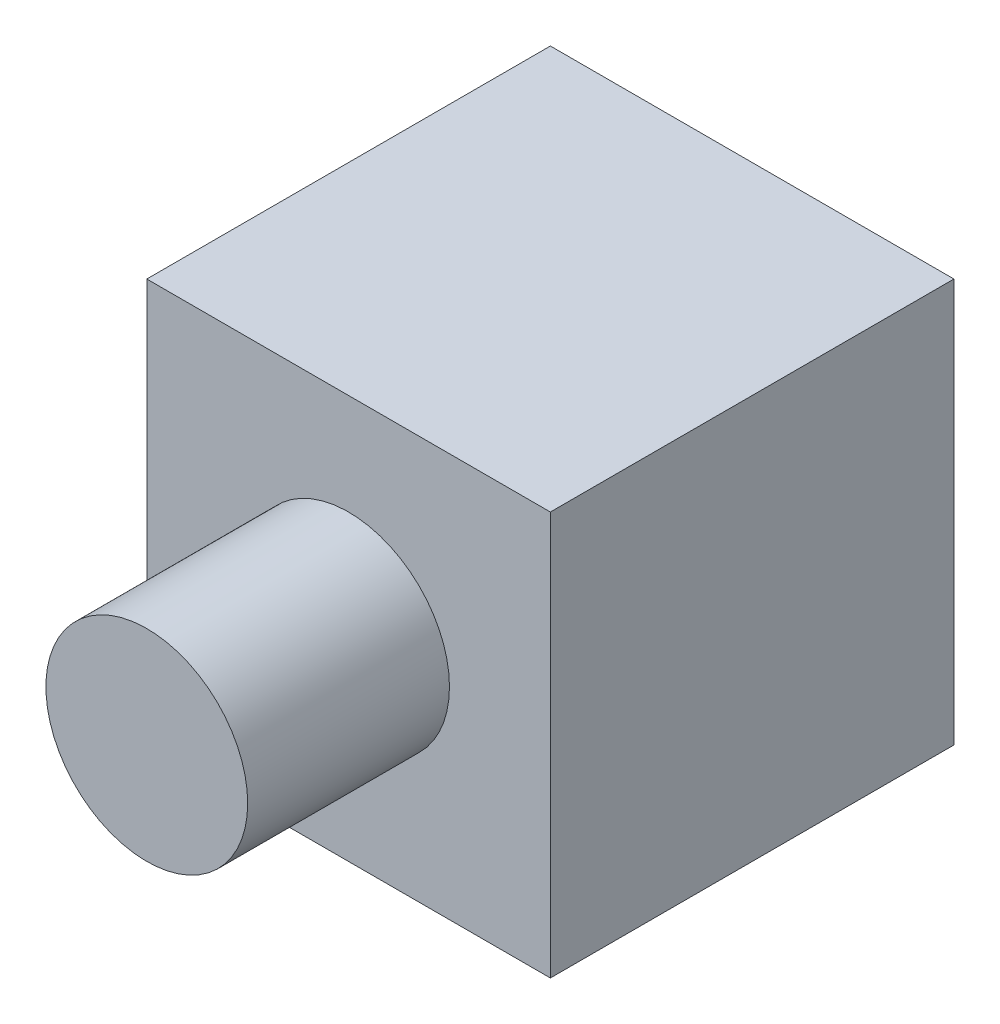
ISO-10303-21;
HEADER;
FILE_DESCRIPTION(('STEP AP214'),'2;1');
FILE_NAME('part.step','',(''),(''),'','','');
FILE_SCHEMA(('AUTOMOTIVE_DESIGN { 1 0 10303 214 1 1 1 1 }'));
ENDSEC;
DATA;
#1=APPLICATION_CONTEXT('core data for automotive mechanical design processes');
#2=APPLICATION_PROTOCOL_DEFINITION('international standard','automotive_design',2000,#1);
#3=PRODUCT_CONTEXT('',#1,'mechanical');
#4=PRODUCT('Part','Part','',(#3));
#5=PRODUCT_RELATED_PRODUCT_CATEGORY('part','',(#4));
#6=PRODUCT_DEFINITION_FORMATION('','',#4);
#7=PRODUCT_DEFINITION_CONTEXT('part definition',#1,'design');
#8=PRODUCT_DEFINITION('design','',#6,#7);
#9=PRODUCT_DEFINITION_SHAPE('','',#8);
#10=(LENGTH_UNIT() NAMED_UNIT(*) SI_UNIT(.MILLI.,.METRE.));
#11=(NAMED_UNIT(*) PLANE_ANGLE_UNIT() SI_UNIT($,.RADIAN.));
#12=(NAMED_UNIT(*) SI_UNIT($,.STERADIAN.) SOLID_ANGLE_UNIT());
#13=UNCERTAINTY_MEASURE_WITH_UNIT(LENGTH_MEASURE(1.E-05),#10,'distance_accuracy_value','');
#14=(GEOMETRIC_REPRESENTATION_CONTEXT(3) GLOBAL_UNCERTAINTY_ASSIGNED_CONTEXT((#13)) GLOBAL_UNIT_ASSIGNED_CONTEXT((#10,
#11,#12)) REPRESENTATION_CONTEXT('',''));
#15=CARTESIAN_POINT('',(0.,0.,0.));
#16=DIRECTION('',(0.,0.,1.));
#17=DIRECTION('',(1.,0.,0.));
#18=AXIS2_PLACEMENT_3D('',#15,#16,#17);
#19=CARTESIAN_POINT('',(25.4,25.4,-50.8));
#20=DIRECTION('',(1.,0.,0.));
#21=DIRECTION('',(0.,1.,0.));
#22=AXIS2_PLACEMENT_3D('',#19,#20,#21);
#23=PLANE('',#22);
#24=DIRECTION('',(0.,1.,0.));
#25=VECTOR('',#24,1.);
#26=CARTESIAN_POINT('',(25.4,25.4,0.));
#27=LINE('',#26,#25);
#28=CARTESIAN_POINT('',(25.4,-25.4,0.));
#29=VERTEX_POINT('',#28);
#30=CARTESIAN_POINT('',(25.4,25.4,0.));
#31=VERTEX_POINT('',#30);
#32=EDGE_CURVE('E110',#29,#31,#27,.T.);
#33=ORIENTED_EDGE('',*,*,#32,.F.);
#34=DIRECTION('',(0.,0.,1.));
#35=VECTOR('',#34,1.);
#36=CARTESIAN_POINT('',(25.4,-25.4,-50.8));
#37=LINE('',#36,#35);
#38=CARTESIAN_POINT('',(25.4,-25.4,-50.8));
#39=VERTEX_POINT('',#38);
#40=EDGE_CURVE('E48',#39,#29,#37,.T.);
#41=ORIENTED_EDGE('',*,*,#40,.F.);
#42=DIRECTION('',(0.,1.,0.));
#43=VECTOR('',#42,1.);
#44=CARTESIAN_POINT('',(25.4,25.4,-50.8));
#45=LINE('',#44,#43);
#46=CARTESIAN_POINT('',(25.4,25.4,-50.8));
#47=VERTEX_POINT('',#46);
#48=EDGE_CURVE('E102',#39,#47,#45,.T.);
#49=ORIENTED_EDGE('',*,*,#48,.T.);
#50=DIRECTION('',(0.,0.,1.));
#51=VECTOR('',#50,1.);
#52=CARTESIAN_POINT('',(25.4,25.4,-50.8));
#53=LINE('',#52,#51);
#54=EDGE_CURVE('E41',#47,#31,#53,.T.);
#55=ORIENTED_EDGE('',*,*,#54,.T.);
#56=EDGE_LOOP('',(#33,#41,#49,#55));
#57=FACE_BOUND('',#56,.T.);
#58=ADVANCED_FACE('F38',(#57),#23,.T.);
#59=CARTESIAN_POINT('',(-25.4,-25.4,-50.8));
#60=DIRECTION('',(0.,-1.,0.));
#61=DIRECTION('',(0.,0.,-1.));
#62=AXIS2_PLACEMENT_3D('',#59,#60,#61);
#63=PLANE('',#62);
#64=DIRECTION('',(1.,0.,0.));
#65=VECTOR('',#64,1.);
#66=CARTESIAN_POINT('',(-25.4,-25.4,0.));
#67=LINE('',#66,#65);
#68=CARTESIAN_POINT('',(-25.4,-25.4,0.));
#69=VERTEX_POINT('',#68);
#70=EDGE_CURVE('E105',#69,#29,#67,.T.);
#71=ORIENTED_EDGE('',*,*,#70,.F.);
#72=DIRECTION('',(0.,0.,1.));
#73=VECTOR('',#72,1.);
#74=CARTESIAN_POINT('',(-25.4,-25.4,-50.8));
#75=LINE('',#74,#73);
#76=CARTESIAN_POINT('',(-25.4,-25.4,-50.8));
#77=VERTEX_POINT('',#76);
#78=EDGE_CURVE('E73',#77,#69,#75,.T.);
#79=ORIENTED_EDGE('',*,*,#78,.F.);
#80=DIRECTION('',(1.,0.,0.));
#81=VECTOR('',#80,1.);
#82=CARTESIAN_POINT('',(-25.4,-25.4,-50.8));
#83=LINE('',#82,#81);
#84=EDGE_CURVE('E97',#77,#39,#83,.T.);
#85=ORIENTED_EDGE('',*,*,#84,.T.);
#86=ORIENTED_EDGE('',*,*,#40,.T.);
#87=EDGE_LOOP('',(#71,#79,#85,#86));
#88=FACE_BOUND('',#87,.T.);
#89=ADVANCED_FACE('F129',(#88),#63,.T.);
#90=CARTESIAN_POINT('',(-25.4,25.4,-50.8));
#91=DIRECTION('',(-1.,0.,0.));
#92=DIRECTION('',(0.,-1.,0.));
#93=AXIS2_PLACEMENT_3D('',#90,#91,#92);
#94=PLANE('',#93);
#95=DIRECTION('',(0.,-1.,0.));
#96=VECTOR('',#95,1.);
#97=CARTESIAN_POINT('',(-25.4,25.4,0.));
#98=LINE('',#97,#96);
#99=CARTESIAN_POINT('',(-25.4,25.4,0.));
#100=VERTEX_POINT('',#99);
#101=EDGE_CURVE('E91',#100,#69,#98,.T.);
#102=ORIENTED_EDGE('',*,*,#101,.F.);
#103=DIRECTION('',(0.,0.,1.));
#104=VECTOR('',#103,1.);
#105=CARTESIAN_POINT('',(-25.4,25.4,-50.8));
#106=LINE('',#105,#104);
#107=CARTESIAN_POINT('',(-25.4,25.4,-50.8));
#108=VERTEX_POINT('',#107);
#109=EDGE_CURVE('E86',#108,#100,#106,.T.);
#110=ORIENTED_EDGE('',*,*,#109,.F.);
#111=DIRECTION('',(0.,-1.,0.));
#112=VECTOR('',#111,1.);
#113=CARTESIAN_POINT('',(-25.4,25.4,-50.8));
#114=LINE('',#113,#112);
#115=EDGE_CURVE('E89',#108,#77,#114,.T.);
#116=ORIENTED_EDGE('',*,*,#115,.T.);
#117=ORIENTED_EDGE('',*,*,#78,.T.);
#118=EDGE_LOOP('',(#102,#110,#116,#117));
#119=FACE_BOUND('',#118,.T.);
#120=ADVANCED_FACE('F88',(#119),#94,.T.);
#121=CARTESIAN_POINT('',(-25.4,25.4,-50.8));
#122=DIRECTION('',(0.,1.,0.));
#123=DIRECTION('',(0.,0.,1.));
#124=AXIS2_PLACEMENT_3D('',#121,#122,#123);
#125=PLANE('',#124);
#126=DIRECTION('',(-1.,0.,0.));
#127=VECTOR('',#126,1.);
#128=CARTESIAN_POINT('',(-25.4,25.4,0.));
#129=LINE('',#128,#127);
#130=EDGE_CURVE('E114',#31,#100,#129,.T.);
#131=ORIENTED_EDGE('',*,*,#130,.F.);
#132=ORIENTED_EDGE('',*,*,#54,.F.);
#133=DIRECTION('',(-1.,0.,0.));
#134=VECTOR('',#133,1.);
#135=CARTESIAN_POINT('',(-25.4,25.4,-50.8));
#136=LINE('',#135,#134);
#137=EDGE_CURVE('E96',#47,#108,#136,.T.);
#138=ORIENTED_EDGE('',*,*,#137,.T.);
#139=ORIENTED_EDGE('',*,*,#109,.T.);
#140=EDGE_LOOP('',(#131,#132,#138,#139));
#141=FACE_BOUND('',#140,.T.);
#142=ADVANCED_FACE('F100',(#141),#125,.T.);
#143=CARTESIAN_POINT('',(0.,0.,-50.8));
#144=DIRECTION('',(0.,0.,1.));
#145=DIRECTION('',(1.,0.,0.));
#146=AXIS2_PLACEMENT_3D('',#143,#144,#145);
#147=PLANE('',#146);
#148=CARTESIAN_POINT('',(0.,0.,-50.8));
#149=DIRECTION('',(0.,0.,-1.));
#150=DIRECTION('',(-1.,0.,0.));
#151=AXIS2_PLACEMENT_3D('',#148,#149,#150);
#152=CIRCLE('',#151,12.7);
#153=CARTESIAN_POINT('',(-12.7,0.,-50.8));
#154=VERTEX_POINT('',#153);
#155=EDGE_CURVE('E171',#154,#154,#152,.T.);
#156=ORIENTED_EDGE('',*,*,#155,.F.);
#157=EDGE_LOOP('',(#156));
#158=FACE_BOUND('',#157,.T.);
#159=ORIENTED_EDGE('',*,*,#48,.F.);
#160=ORIENTED_EDGE('',*,*,#84,.F.);
#161=ORIENTED_EDGE('',*,*,#115,.F.);
#162=ORIENTED_EDGE('',*,*,#137,.F.);
#163=EDGE_LOOP('',(#159,#160,#161,#162));
#164=FACE_BOUND('',#163,.T.);
#165=ADVANCED_FACE('F95',(#158,#164),#147,.F.);
#166=CARTESIAN_POINT('',(0.,0.,0.));
#167=DIRECTION('',(0.,0.,1.));
#168=DIRECTION('',(1.,0.,0.));
#169=AXIS2_PLACEMENT_3D('',#166,#167,#168);
#170=PLANE('',#169);
#171=CARTESIAN_POINT('',(0.,0.,0.));
#172=DIRECTION('',(0.,0.,1.));
#173=DIRECTION('',(1.,0.,0.));
#174=AXIS2_PLACEMENT_3D('',#171,#172,#173);
#175=CIRCLE('',#174,12.7);
#176=CARTESIAN_POINT('',(12.7,0.,0.));
#177=VERTEX_POINT('',#176);
#178=EDGE_CURVE('E11',#177,#177,#175,.T.);
#179=ORIENTED_EDGE('',*,*,#178,.F.);
#180=EDGE_LOOP('',(#179));
#181=FACE_BOUND('',#180,.T.);
#182=ORIENTED_EDGE('',*,*,#32,.T.);
#183=ORIENTED_EDGE('',*,*,#130,.T.);
#184=ORIENTED_EDGE('',*,*,#101,.T.);
#185=ORIENTED_EDGE('',*,*,#70,.T.);
#186=EDGE_LOOP('',(#182,#183,#184,#185));
#187=FACE_BOUND('',#186,.T.);
#188=ADVANCED_FACE('F128',(#181,#187),#170,.T.);
#189=CARTESIAN_POINT('',(0.,0.,25.4));
#190=DIRECTION('',(0.,0.,-1.));
#191=DIRECTION('',(-1.,0.,0.));
#192=AXIS2_PLACEMENT_3D('',#189,#190,#191);
#193=CYLINDRICAL_SURFACE('',#192,12.7);
#194=CARTESIAN_POINT('',(0.,0.,25.4));
#195=DIRECTION('',(0.,0.,1.));
#196=DIRECTION('',(1.,0.,0.));
#197=AXIS2_PLACEMENT_3D('',#194,#195,#196);
#198=CIRCLE('',#197,12.7);
#199=CARTESIAN_POINT('',(12.7,0.,25.4));
#200=VERTEX_POINT('',#199);
#201=EDGE_CURVE('E115',#200,#200,#198,.T.);
#202=ORIENTED_EDGE('',*,*,#201,.F.);
#203=EDGE_LOOP('',(#202));
#204=FACE_BOUND('',#203,.T.);
#205=ORIENTED_EDGE('',*,*,#178,.T.);
#206=EDGE_LOOP('',(#205));
#207=FACE_BOUND('',#206,.T.);
#208=ADVANCED_FACE('F147',(#204,#207),#193,.T.);
#209=CARTESIAN_POINT('',(0.,0.,25.4));
#210=DIRECTION('',(0.,0.,1.));
#211=DIRECTION('',(1.,0.,0.));
#212=AXIS2_PLACEMENT_3D('',#209,#210,#211);
#213=PLANE('',#212);
#214=ORIENTED_EDGE('',*,*,#201,.T.);
#215=EDGE_LOOP('',(#214));
#216=FACE_BOUND('',#215,.T.);
#217=ADVANCED_FACE('F153',(#216),#213,.T.);
#218=CARTESIAN_POINT('',(0.,0.,-25.4));
#219=DIRECTION('',(0.,0.,-1.));
#220=DIRECTION('',(-1.,0.,0.));
#221=AXIS2_PLACEMENT_3D('',#218,#219,#220);
#222=CYLINDRICAL_SURFACE('',#221,12.7);
#223=CARTESIAN_POINT('',(0.,0.,-25.4));
#224=DIRECTION('',(0.,0.,-1.));
#225=DIRECTION('',(-1.,0.,0.));
#226=AXIS2_PLACEMENT_3D('',#223,#224,#225);
#227=CIRCLE('',#226,12.7);
#228=CARTESIAN_POINT('',(-12.7,0.,-25.4));
#229=VERTEX_POINT('',#228);
#230=EDGE_CURVE('E169',#229,#229,#227,.T.);
#231=ORIENTED_EDGE('',*,*,#230,.F.);
#232=EDGE_LOOP('',(#231));
#233=FACE_BOUND('',#232,.T.);
#234=ORIENTED_EDGE('',*,*,#155,.T.);
#235=EDGE_LOOP('',(#234));
#236=FACE_BOUND('',#235,.T.);
#237=ADVANCED_FACE('F157',(#233,#236),#222,.F.);
#238=CARTESIAN_POINT('',(0.,0.,-25.4));
#239=DIRECTION('',(0.,0.,-1.));
#240=DIRECTION('',(-1.,0.,0.));
#241=AXIS2_PLACEMENT_3D('',#238,#239,#240);
#242=PLANE('',#241);
#243=ORIENTED_EDGE('',*,*,#230,.T.);
#244=EDGE_LOOP('',(#243));
#245=FACE_BOUND('',#244,.T.);
#246=ADVANCED_FACE('F161',(#245),#242,.T.);
#247=CLOSED_SHELL('',(#58,#89,#120,#142,#165,#188,#208,#217,#237,#246));
#248=MANIFOLD_SOLID_BREP('B2',#247);
#249=ADVANCED_BREP_SHAPE_REPRESENTATION('',(#18,#248),#14);
#250=SHAPE_DEFINITION_REPRESENTATION(#9,#249);
ENDSEC;
END-ISO-10303-21;
